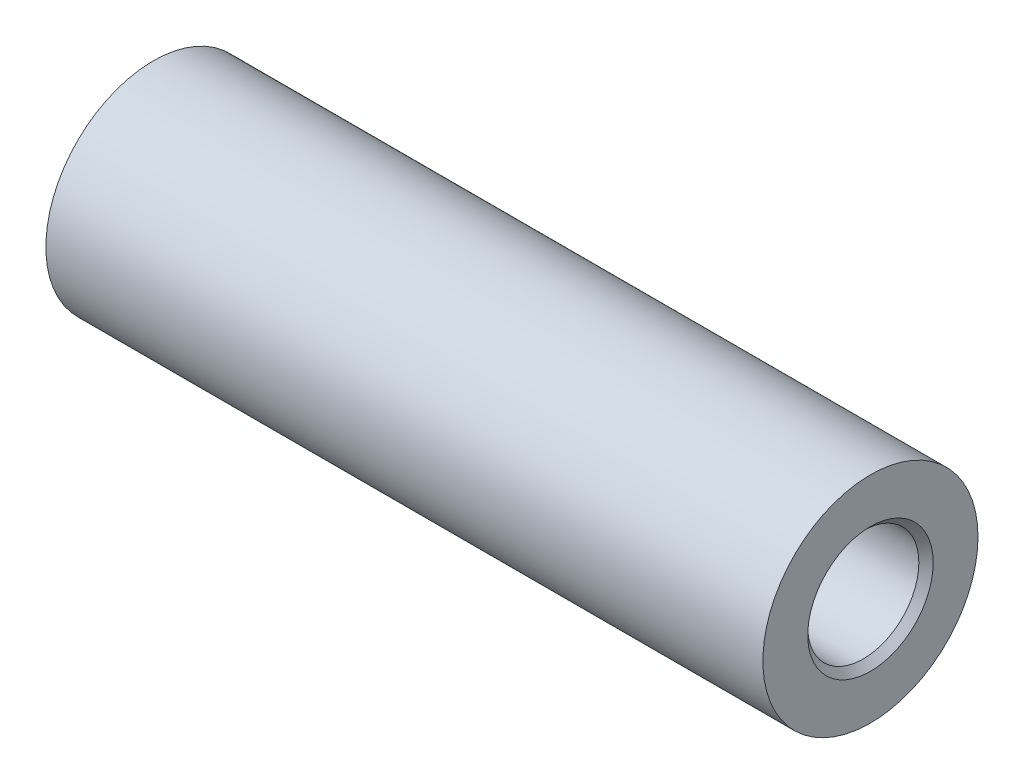
ISO-10303-21;
HEADER;
FILE_DESCRIPTION(('STEP AP214'),'2;1');
FILE_NAME('part.step','',(''),(''),'','','');
FILE_SCHEMA(('AUTOMOTIVE_DESIGN { 1 0 10303 214 1 1 1 1 }'));
ENDSEC;
DATA;
#1=APPLICATION_CONTEXT('core data for automotive mechanical design processes');
#2=APPLICATION_PROTOCOL_DEFINITION('international standard','automotive_design',2000,#1);
#3=PRODUCT_CONTEXT('',#1,'mechanical');
#4=PRODUCT('Part','Part','',(#3));
#5=PRODUCT_RELATED_PRODUCT_CATEGORY('part','',(#4));
#6=PRODUCT_DEFINITION_FORMATION('','',#4);
#7=PRODUCT_DEFINITION_CONTEXT('part definition',#1,'design');
#8=PRODUCT_DEFINITION('design','',#6,#7);
#9=PRODUCT_DEFINITION_SHAPE('','',#8);
#10=(LENGTH_UNIT() NAMED_UNIT(*) SI_UNIT(.MILLI.,.METRE.));
#11=(NAMED_UNIT(*) PLANE_ANGLE_UNIT() SI_UNIT($,.RADIAN.));
#12=(NAMED_UNIT(*) SI_UNIT($,.STERADIAN.) SOLID_ANGLE_UNIT());
#13=UNCERTAINTY_MEASURE_WITH_UNIT(LENGTH_MEASURE(1.E-05),#10,'distance_accuracy_value','');
#14=(GEOMETRIC_REPRESENTATION_CONTEXT(3) GLOBAL_UNCERTAINTY_ASSIGNED_CONTEXT((#13)) GLOBAL_UNIT_ASSIGNED_CONTEXT((#10,
#11,#12)) REPRESENTATION_CONTEXT('',''));
#15=CARTESIAN_POINT('',(0.,0.,0.));
#16=DIRECTION('',(0.,0.,1.));
#17=DIRECTION('',(1.,0.,0.));
#18=AXIS2_PLACEMENT_3D('',#15,#16,#17);
#19=CARTESIAN_POINT('',(0.,0.,0.));
#20=DIRECTION('',(-1.,0.,0.));
#21=DIRECTION('',(0.,0.,1.));
#22=AXIS2_PLACEMENT_3D('',#19,#20,#21);
#23=CYLINDRICAL_SURFACE('',#22,4.1);
#24=CARTESIAN_POINT('',(-20.6,0.,0.));
#25=DIRECTION('',(1.,0.,0.));
#26=DIRECTION('',(0.,0.,-1.));
#27=AXIS2_PLACEMENT_3D('',#24,#25,#26);
#28=CIRCLE('',#27,4.1);
#29=CARTESIAN_POINT('',(-20.6,0.,4.1));
#30=VERTEX_POINT('',#29);
#31=EDGE_CURVE('E138',#30,#30,#28,.F.);
#32=ORIENTED_EDGE('',*,*,#31,.T.);
#33=EDGE_LOOP('',(#32));
#34=FACE_BOUND('',#33,.T.);
#35=DIRECTION('',(1.,0.,0.));
#36=VECTOR('',#35,1.);
#37=CARTESIAN_POINT('',(-15.,3.70860840829682,-1.74820584426152));
#38=LINE('',#37,#36);
#39=CARTESIAN_POINT('',(-14.5,3.70860840829682,-1.74820584426152));
#40=VERTEX_POINT('',#39);
#41=CARTESIAN_POINT('',(0.,3.70860840829682,-1.74820584426152));
#42=VERTEX_POINT('',#41);
#43=EDGE_CURVE('E101',#40,#42,#38,.T.);
#44=ORIENTED_EDGE('',*,*,#43,.F.);
#45=CARTESIAN_POINT('',(-10.9,0.,0.));
#46=DIRECTION('',(-0.707106781186545,-0.705896069439704,-0.0413610825484487));
#47=DIRECTION('',(-0.70710678118655,0.7058960694397,0.0413610825484484));
#48=AXIS2_PLACEMENT_3D('',#45,#46,#47);
#49=ELLIPSE('',#48,5.79827560572971,4.1);
#50=CARTESIAN_POINT('',(-15.,4.09297995961269,0.239822955967241));
#51=VERTEX_POINT('',#50);
#52=EDGE_CURVE('E69',#40,#51,#49,.F.);
#53=ORIENTED_EDGE('',*,*,#52,.T.);
#54=CARTESIAN_POINT('',(-10.9,0.,0.));
#55=DIRECTION('',(-0.707106781186545,-0.705896069439704,-0.0413610825484487));
#56=DIRECTION('',(-0.70710678118655,0.7058960694397,0.0413610825484484));
#57=AXIS2_PLACEMENT_3D('',#54,#55,#56);
#58=ELLIPSE('',#57,5.79827560572971,4.1);
#59=CARTESIAN_POINT('',(-14.5,3.47906371590109,2.16935835230156));
#60=VERTEX_POINT('',#59);
#61=EDGE_CURVE('E96',#51,#60,#58,.F.);
#62=ORIENTED_EDGE('',*,*,#61,.T.);
#63=DIRECTION('',(1.,0.,0.));
#64=VECTOR('',#63,1.);
#65=CARTESIAN_POINT('',(-15.,3.47906371590109,2.16935835230156));
#66=LINE('',#65,#64);
#67=CARTESIAN_POINT('',(0.,3.47906371590109,2.16935835230156));
#68=VERTEX_POINT('',#67);
#69=EDGE_CURVE('E92',#60,#68,#66,.T.);
#70=ORIENTED_EDGE('',*,*,#69,.T.);
#71=CARTESIAN_POINT('',(0.,0.,0.));
#72=DIRECTION('',(-1.,0.,0.));
#73=DIRECTION('',(0.,0.,1.));
#74=AXIS2_PLACEMENT_3D('',#71,#72,#73);
#75=CIRCLE('',#74,4.1);
#76=EDGE_CURVE('E95',#42,#68,#75,.T.);
#77=ORIENTED_EDGE('',*,*,#76,.F.);
#78=EDGE_LOOP('',(#44,#53,#62,#70,#77));
#79=FACE_BOUND('',#78,.T.);
#80=ADVANCED_FACE('F46',(#34,#79),#23,.F.);
#81=CARTESIAN_POINT('',(0.,0.,0.));
#82=DIRECTION('',(-1.,0.,0.));
#83=DIRECTION('',(0.,0.,1.));
#84=AXIS2_PLACEMENT_3D('',#81,#82,#83);
#85=PLANE('',#84);
#86=ORIENTED_EDGE('',*,*,#76,.T.);
#87=DIRECTION('',(0.,-0.058493403894449,0.998287795027487));
#88=VECTOR('',#87,1.);
#89=CARTESIAN_POINT('',(0.,3.70860840829682,-1.74820584426152));
#90=LINE('',#89,#88);
#91=EDGE_CURVE('E102',#42,#68,#90,.T.);
#92=ORIENTED_EDGE('',*,*,#91,.F.);
#93=EDGE_LOOP('',(#86,#92));
#94=FACE_BOUND('',#93,.T.);
#95=ADVANCED_FACE('F109',(#94),#85,.T.);
#96=CARTESIAN_POINT('',(2.,0.,0.));
#97=DIRECTION('',(1.,0.,0.));
#98=DIRECTION('',(0.,0.,-1.));
#99=AXIS2_PLACEMENT_3D('',#96,#97,#98);
#100=CYLINDRICAL_SURFACE('',#99,3.1);
#101=CARTESIAN_POINT('',(18.6,0.,0.));
#102=DIRECTION('',(1.,0.,0.));
#103=DIRECTION('',(0.,0.,-1.));
#104=AXIS2_PLACEMENT_3D('',#101,#102,#103);
#105=CIRCLE('',#104,3.1);
#106=CARTESIAN_POINT('',(18.6,0.,-3.1));
#107=VERTEX_POINT('',#106);
#108=EDGE_CURVE('E130',#107,#107,#105,.T.);
#109=ORIENTED_EDGE('',*,*,#108,.T.);
#110=EDGE_LOOP('',(#109));
#111=FACE_BOUND('',#110,.T.);
#112=DIRECTION('',(-1.,0.,0.));
#113=VECTOR('',#112,1.);
#114=CARTESIAN_POINT('',(14.,2.6,1.68819430161341));
#115=LINE('',#114,#113);
#116=CARTESIAN_POINT('',(13.5,2.6,1.68819430161341));
#117=VERTEX_POINT('',#116);
#118=CARTESIAN_POINT('',(2.,2.6,1.68819430161341));
#119=VERTEX_POINT('',#118);
#120=EDGE_CURVE('E112',#117,#119,#115,.T.);
#121=ORIENTED_EDGE('',*,*,#120,.F.);
#122=CARTESIAN_POINT('',(10.9,0.,0.));
#123=DIRECTION('',(0.707106781186545,-0.70710678118655,0.));
#124=DIRECTION('',(0.70710678118655,0.707106781186545,0.));
#125=AXIS2_PLACEMENT_3D('',#122,#123,#124);
#126=ELLIPSE('',#125,4.38406204335661,3.1);
#127=CARTESIAN_POINT('',(14.,3.1,0.));
#128=VERTEX_POINT('',#127);
#129=EDGE_CURVE('E11',#117,#128,#126,.F.);
#130=ORIENTED_EDGE('',*,*,#129,.T.);
#131=CARTESIAN_POINT('',(10.9,0.,0.));
#132=DIRECTION('',(0.707106781186545,-0.70710678118655,0.));
#133=DIRECTION('',(0.70710678118655,0.707106781186545,0.));
#134=AXIS2_PLACEMENT_3D('',#131,#132,#133);
#135=ELLIPSE('',#134,4.38406204335661,3.1);
#136=CARTESIAN_POINT('',(13.5,2.6,-1.68819430161341));
#137=VERTEX_POINT('',#136);
#138=EDGE_CURVE('E56',#128,#137,#135,.F.);
#139=ORIENTED_EDGE('',*,*,#138,.T.);
#140=DIRECTION('',(-1.,0.,0.));
#141=VECTOR('',#140,1.);
#142=CARTESIAN_POINT('',(14.,2.6,-1.68819430161341));
#143=LINE('',#142,#141);
#144=CARTESIAN_POINT('',(2.,2.6,-1.68819430161341));
#145=VERTEX_POINT('',#144);
#146=EDGE_CURVE('E119',#137,#145,#143,.T.);
#147=ORIENTED_EDGE('',*,*,#146,.T.);
#148=CARTESIAN_POINT('',(2.,0.,0.));
#149=DIRECTION('',(1.,0.,0.));
#150=DIRECTION('',(0.,0.,-1.));
#151=AXIS2_PLACEMENT_3D('',#148,#149,#150);
#152=CIRCLE('',#151,3.1);
#153=EDGE_CURVE('E111',#119,#145,#152,.T.);
#154=ORIENTED_EDGE('',*,*,#153,.F.);
#155=EDGE_LOOP('',(#121,#130,#139,#147,#154));
#156=FACE_BOUND('',#155,.T.);
#157=ADVANCED_FACE('F158',(#111,#156),#100,.F.);
#158=CARTESIAN_POINT('',(2.,0.,0.));
#159=DIRECTION('',(1.,0.,0.));
#160=DIRECTION('',(0.,0.,-1.));
#161=AXIS2_PLACEMENT_3D('',#158,#159,#160);
#162=PLANE('',#161);
#163=ORIENTED_EDGE('',*,*,#153,.T.);
#164=DIRECTION('',(0.,0.,-1.));
#165=VECTOR('',#164,1.);
#166=CARTESIAN_POINT('',(2.,2.6,1.68819430161341));
#167=LINE('',#166,#165);
#168=EDGE_CURVE('E166',#119,#145,#167,.T.);
#169=ORIENTED_EDGE('',*,*,#168,.F.);
#170=EDGE_LOOP('',(#163,#169));
#171=FACE_BOUND('',#170,.T.);
#172=ADVANCED_FACE('F186',(#171),#162,.T.);
#173=CARTESIAN_POINT('',(-21.,0.,0.));
#174=DIRECTION('',(1.,0.,0.));
#175=DIRECTION('',(0.,0.,-1.));
#176=AXIS2_PLACEMENT_3D('',#173,#174,#175);
#177=CYLINDRICAL_SURFACE('',#176,6.);
#178=CARTESIAN_POINT('',(-21.,0.,0.));
#179=DIRECTION('',(1.,0.,0.));
#180=DIRECTION('',(0.,0.,-1.));
#181=AXIS2_PLACEMENT_3D('',#178,#179,#180);
#182=CIRCLE('',#181,6.);
#183=CARTESIAN_POINT('',(-21.,0.,-6.));
#184=VERTEX_POINT('',#183);
#185=EDGE_CURVE('E126',#184,#184,#182,.T.);
#186=CARTESIAN_POINT('',(19.,0.,0.));
#187=DIRECTION('',(1.,0.,0.));
#188=DIRECTION('',(0.,0.,-1.));
#189=AXIS2_PLACEMENT_3D('',#186,#187,#188);
#190=CIRCLE('',#189,6.);
#191=CARTESIAN_POINT('',(19.,0.,-6.));
#192=VERTEX_POINT('',#191);
#193=EDGE_CURVE('E117',#192,#192,#190,.T.);
#194=CARTESIAN_POINT('',(-21.,0.,-6.));
#195=CARTESIAN_POINT('',(-20.5833333333333,0.,-6.));
#196=CARTESIAN_POINT('',(-20.1666666666667,0.,-6.));
#197=CARTESIAN_POINT('',(-19.3333333333333,0.,-6.));
#198=CARTESIAN_POINT('',(-18.9166666666667,0.,-6.));
#199=CARTESIAN_POINT('',(-18.0833333333333,0.,-6.));
#200=CARTESIAN_POINT('',(-17.6666666666667,0.,-6.));
#201=CARTESIAN_POINT('',(-16.8333333333333,0.,-6.));
#202=CARTESIAN_POINT('',(-16.4166666666667,0.,-6.));
#203=CARTESIAN_POINT('',(-15.5833333333333,0.,-6.));
#204=CARTESIAN_POINT('',(-15.1666666666667,0.,-6.));
#205=CARTESIAN_POINT('',(-14.3333333333333,0.,-6.));
#206=CARTESIAN_POINT('',(-13.9166666666667,0.,-6.));
#207=CARTESIAN_POINT('',(-13.0833333333333,0.,-6.));
#208=CARTESIAN_POINT('',(-12.6666666666667,0.,-6.));
#209=CARTESIAN_POINT('',(-11.8333333333333,0.,-6.));
#210=CARTESIAN_POINT('',(-11.4166666666667,0.,-6.));
#211=CARTESIAN_POINT('',(-10.5833333333333,0.,-6.));
#212=CARTESIAN_POINT('',(-10.1666666666667,0.,-6.));
#213=CARTESIAN_POINT('',(-9.33333333333334,0.,-6.));
#214=CARTESIAN_POINT('',(-8.91666666666667,0.,-6.));
#215=CARTESIAN_POINT('',(-8.08333333333334,0.,-6.));
#216=CARTESIAN_POINT('',(-7.66666666666667,0.,-6.));
#217=CARTESIAN_POINT('',(-6.83333333333334,0.,-6.));
#218=CARTESIAN_POINT('',(-6.41666666666667,0.,-6.));
#219=CARTESIAN_POINT('',(-5.58333333333334,0.,-6.));
#220=CARTESIAN_POINT('',(-5.16666666666667,0.,-6.));
#221=CARTESIAN_POINT('',(-4.33333333333334,0.,-6.));
#222=CARTESIAN_POINT('',(-3.91666666666667,0.,-6.));
#223=CARTESIAN_POINT('',(-3.08333333333334,0.,-6.));
#224=CARTESIAN_POINT('',(-2.66666666666667,0.,-6.));
#225=CARTESIAN_POINT('',(-1.83333333333334,0.,-6.));
#226=CARTESIAN_POINT('',(-1.41666666666667,0.,-6.));
#227=CARTESIAN_POINT('',(-0.583333333333337,0.,-6.));
#228=CARTESIAN_POINT('',(-0.16666666666667,0.,-6.));
#229=CARTESIAN_POINT('',(0.666666666666664,0.,-6.));
#230=CARTESIAN_POINT('',(1.08333333333333,0.,-6.));
#231=CARTESIAN_POINT('',(1.91666666666666,0.,-6.));
#232=CARTESIAN_POINT('',(2.33333333333333,0.,-6.));
#233=CARTESIAN_POINT('',(3.16666666666666,0.,-6.));
#234=CARTESIAN_POINT('',(3.58333333333333,0.,-6.));
#235=CARTESIAN_POINT('',(4.41666666666666,0.,-6.));
#236=CARTESIAN_POINT('',(4.83333333333333,0.,-6.));
#237=CARTESIAN_POINT('',(5.66666666666666,0.,-6.));
#238=CARTESIAN_POINT('',(6.08333333333333,0.,-6.));
#239=CARTESIAN_POINT('',(6.91666666666666,0.,-6.));
#240=CARTESIAN_POINT('',(7.33333333333333,0.,-6.));
#241=CARTESIAN_POINT('',(8.16666666666666,0.,-6.));
#242=CARTESIAN_POINT('',(8.58333333333333,0.,-6.));
#243=CARTESIAN_POINT('',(9.41666666666667,0.,-6.));
#244=CARTESIAN_POINT('',(9.83333333333333,0.,-6.));
#245=CARTESIAN_POINT('',(10.6666666666667,0.,-6.));
#246=CARTESIAN_POINT('',(11.0833333333333,0.,-6.));
#247=CARTESIAN_POINT('',(11.9166666666667,0.,-6.));
#248=CARTESIAN_POINT('',(12.3333333333333,0.,-6.));
#249=CARTESIAN_POINT('',(13.1666666666667,0.,-6.));
#250=CARTESIAN_POINT('',(13.5833333333333,0.,-6.));
#251=CARTESIAN_POINT('',(14.4166666666667,0.,-6.));
#252=CARTESIAN_POINT('',(14.8333333333333,0.,-6.));
#253=CARTESIAN_POINT('',(15.6666666666667,0.,-6.));
#254=CARTESIAN_POINT('',(16.0833333333333,0.,-6.));
#255=CARTESIAN_POINT('',(16.9166666666667,0.,-6.));
#256=CARTESIAN_POINT('',(17.3333333333333,0.,-6.));
#257=CARTESIAN_POINT('',(18.1666666666667,0.,-6.));
#258=CARTESIAN_POINT('',(18.5833333333333,0.,-6.));
#259=CARTESIAN_POINT('',(19.,0.,-6.));
#260=B_SPLINE_CURVE_WITH_KNOTS('',3,(#194,#195,#196,#197,#198,#199,#200,#201,#202,#203,#204,
#205,#206,#207,#208,#209,#210,#211,#212,#213,#214,#215,#216,#217,#218,#219,#220,#221,#222,#223,
#224,#225,#226,#227,#228,#229,#230,#231,#232,#233,#234,#235,#236,#237,#238,#239,#240,#241,#242,
#243,#244,#245,#246,#247,#248,#249,#250,#251,#252,#253,#254,#255,#256,#257,#258,#259),
.UNSPECIFIED.,.F.,.F.,(4,2,2,2,2,2,2,2,2,2,2,2,2,2,2,2,2,2,2,2,2,2,2,2,2,2,2,2,2,2,2,2,4),(0.,
1.25,2.5,3.75,5.,6.25,7.5,8.75,10.,11.25,12.5,13.75,15.,16.25,17.5,18.75,20.,21.25,22.5,23.75,
25.,26.25,27.5,28.75,30.,31.25,32.5,33.75,35.,36.25,37.5,38.75,40.),.UNSPECIFIED.);
#261=EDGE_CURVE('BSEAM189',#184,#192,#260,.T.);
#262=ORIENTED_EDGE('',*,*,#185,.T.);
#263=ORIENTED_EDGE('',*,*,#193,.F.);
#264=ORIENTED_EDGE('',*,*,#261,.T.);
#265=ORIENTED_EDGE('',*,*,#261,.F.);
#266=EDGE_LOOP('',(#262,#264,#263,#265));
#267=FACE_BOUND('',#266,.T.);
#268=ADVANCED_FACE('F189',(#267),#177,.T.);
#269=CARTESIAN_POINT('',(-21.,0.,0.));
#270=DIRECTION('',(1.,0.,0.));
#271=DIRECTION('',(0.,0.,-1.));
#272=AXIS2_PLACEMENT_3D('',#269,#270,#271);
#273=PLANE('',#272);
#274=CARTESIAN_POINT('',(-21.,0.,0.));
#275=DIRECTION('',(1.,0.,0.));
#276=DIRECTION('',(0.,0.,-1.));
#277=AXIS2_PLACEMENT_3D('',#274,#275,#276);
#278=CIRCLE('',#277,4.50000000000002);
#279=CARTESIAN_POINT('',(-21.,0.,4.50000000000002));
#280=VERTEX_POINT('',#279);
#281=EDGE_CURVE('E142',#280,#280,#278,.T.);
#282=ORIENTED_EDGE('',*,*,#281,.T.);
#283=EDGE_LOOP('',(#282));
#284=FACE_BOUND('',#283,.T.);
#285=ORIENTED_EDGE('',*,*,#185,.F.);
#286=EDGE_LOOP('',(#285));
#287=FACE_BOUND('',#286,.T.);
#288=ADVANCED_FACE('F196',(#284,#287),#273,.F.);
#289=CARTESIAN_POINT('',(19.,0.,0.));
#290=DIRECTION('',(1.,0.,0.));
#291=DIRECTION('',(0.,0.,-1.));
#292=AXIS2_PLACEMENT_3D('',#289,#290,#291);
#293=PLANE('',#292);
#294=CARTESIAN_POINT('',(19.,0.,0.));
#295=DIRECTION('',(1.,0.,0.));
#296=DIRECTION('',(0.,0.,-1.));
#297=AXIS2_PLACEMENT_3D('',#294,#295,#296);
#298=CIRCLE('',#297,3.5);
#299=CARTESIAN_POINT('',(19.,0.,-3.5));
#300=VERTEX_POINT('',#299);
#301=EDGE_CURVE('E134',#300,#300,#298,.F.);
#302=ORIENTED_EDGE('',*,*,#301,.T.);
#303=EDGE_LOOP('',(#302));
#304=FACE_BOUND('',#303,.T.);
#305=ORIENTED_EDGE('',*,*,#193,.T.);
#306=EDGE_LOOP('',(#305));
#307=FACE_BOUND('',#306,.T.);
#308=ADVANCED_FACE('F193',(#304,#307),#293,.T.);
#309=CARTESIAN_POINT('',(14.,2.6,1.68819430161341));
#310=DIRECTION('',(0.,1.,0.));
#311=DIRECTION('',(0.,0.,1.));
#312=AXIS2_PLACEMENT_3D('',#309,#310,#311);
#313=PLANE('',#312);
#314=ORIENTED_EDGE('',*,*,#146,.F.);
#315=DIRECTION('',(0.,0.,1.));
#316=VECTOR('',#315,1.);
#317=CARTESIAN_POINT('',(13.5,2.6,1.68819430161341));
#318=LINE('',#317,#316);
#319=EDGE_CURVE('E149',#137,#117,#318,.T.);
#320=ORIENTED_EDGE('',*,*,#319,.T.);
#321=ORIENTED_EDGE('',*,*,#120,.T.);
#322=ORIENTED_EDGE('',*,*,#168,.T.);
#323=EDGE_LOOP('',(#314,#320,#321,#322));
#324=FACE_BOUND('',#323,.T.);
#325=ADVANCED_FACE('F164',(#324),#313,.F.);
#326=CARTESIAN_POINT('',(-15.,3.70860840829682,-1.74820584426152));
#327=DIRECTION('',(0.,0.998287795027487,0.058493403894449));
#328=DIRECTION('',(0.,-0.058493403894449,0.998287795027487));
#329=AXIS2_PLACEMENT_3D('',#326,#327,#328);
#330=PLANE('',#329);
#331=ORIENTED_EDGE('',*,*,#69,.F.);
#332=DIRECTION('',(0.,0.058493403894449,-0.998287795027487));
#333=VECTOR('',#332,1.);
#334=CARTESIAN_POINT('',(-14.5,3.70860840829682,-1.74820584426152));
#335=LINE('',#334,#333);
#336=EDGE_CURVE('E146',#60,#40,#335,.T.);
#337=ORIENTED_EDGE('',*,*,#336,.T.);
#338=ORIENTED_EDGE('',*,*,#43,.T.);
#339=ORIENTED_EDGE('',*,*,#91,.T.);
#340=EDGE_LOOP('',(#331,#337,#338,#339));
#341=FACE_BOUND('',#340,.T.);
#342=ADVANCED_FACE('F105',(#341),#330,.F.);
#343=CARTESIAN_POINT('',(18.6,0.,0.));
#344=DIRECTION('',(1.,0.,0.));
#345=DIRECTION('',(0.,0.,-1.));
#346=AXIS2_PLACEMENT_3D('',#343,#344,#345);
#347=CONICAL_SURFACE('',#346,3.1,0.785398163397447);
#348=ORIENTED_EDGE('',*,*,#301,.F.);
#349=EDGE_LOOP('',(#348));
#350=FACE_BOUND('',#349,.T.);
#351=ORIENTED_EDGE('',*,*,#108,.F.);
#352=EDGE_LOOP('',(#351));
#353=FACE_BOUND('',#352,.T.);
#354=ADVANCED_FACE('F205',(#350,#353),#347,.F.);
#355=CARTESIAN_POINT('',(-20.6,0.,0.));
#356=DIRECTION('',(-1.,0.,0.));
#357=DIRECTION('',(0.,0.,1.));
#358=AXIS2_PLACEMENT_3D('',#355,#356,#357);
#359=CONICAL_SURFACE('',#358,4.1,0.785398163397447);
#360=CARTESIAN_POINT('',(-21.,0.,4.50000000000002));
#361=CARTESIAN_POINT('',(-20.9958333333333,0.,4.49583333333335));
#362=CARTESIAN_POINT('',(-20.9916666666667,0.,4.49166666666669));
#363=CARTESIAN_POINT('',(-20.9833333333333,0.,4.48333333333335));
#364=CARTESIAN_POINT('',(-20.9791666666667,0.,4.47916666666669));
#365=CARTESIAN_POINT('',(-20.9708333333333,0.,4.47083333333335));
#366=CARTESIAN_POINT('',(-20.9666666666667,0.,4.46666666666669));
#367=CARTESIAN_POINT('',(-20.9583333333333,0.,4.45833333333335));
#368=CARTESIAN_POINT('',(-20.9541666666667,0.,4.45416666666669));
#369=CARTESIAN_POINT('',(-20.9458333333333,0.,4.44583333333335));
#370=CARTESIAN_POINT('',(-20.9416666666667,0.,4.44166666666669));
#371=CARTESIAN_POINT('',(-20.9333333333333,0.,4.43333333333335));
#372=CARTESIAN_POINT('',(-20.9291666666667,0.,4.42916666666668));
#373=CARTESIAN_POINT('',(-20.9208333333333,0.,4.42083333333335));
#374=CARTESIAN_POINT('',(-20.9166666666667,0.,4.41666666666668));
#375=CARTESIAN_POINT('',(-20.9083333333333,0.,4.40833333333335));
#376=CARTESIAN_POINT('',(-20.9041666666667,0.,4.40416666666668));
#377=CARTESIAN_POINT('',(-20.8958333333333,0.,4.39583333333335));
#378=CARTESIAN_POINT('',(-20.8916666666667,0.,4.39166666666668));
#379=CARTESIAN_POINT('',(-20.8833333333333,0.,4.38333333333335));
#380=CARTESIAN_POINT('',(-20.8791666666667,0.,4.37916666666668));
#381=CARTESIAN_POINT('',(-20.8708333333333,0.,4.37083333333335));
#382=CARTESIAN_POINT('',(-20.8666666666667,0.,4.36666666666668));
#383=CARTESIAN_POINT('',(-20.8583333333333,0.,4.35833333333335));
#384=CARTESIAN_POINT('',(-20.8541666666667,0.,4.35416666666668));
#385=CARTESIAN_POINT('',(-20.8458333333333,0.,4.34583333333335));
#386=CARTESIAN_POINT('',(-20.8416666666667,0.,4.34166666666668));
#387=CARTESIAN_POINT('',(-20.8333333333333,0.,4.33333333333335));
#388=CARTESIAN_POINT('',(-20.8291666666667,0.,4.32916666666668));
#389=CARTESIAN_POINT('',(-20.8208333333333,0.,4.32083333333334));
#390=CARTESIAN_POINT('',(-20.8166666666667,0.,4.31666666666668));
#391=CARTESIAN_POINT('',(-20.8083333333333,0.,4.30833333333334));
#392=CARTESIAN_POINT('',(-20.8041666666667,0.,4.30416666666668));
#393=CARTESIAN_POINT('',(-20.7958333333333,0.,4.29583333333334));
#394=CARTESIAN_POINT('',(-20.7916666666667,0.,4.29166666666668));
#395=CARTESIAN_POINT('',(-20.7833333333333,0.,4.28333333333334));
#396=CARTESIAN_POINT('',(-20.7791666666667,0.,4.27916666666668));
#397=CARTESIAN_POINT('',(-20.7708333333333,0.,4.27083333333334));
#398=CARTESIAN_POINT('',(-20.7666666666667,0.,4.26666666666667));
#399=CARTESIAN_POINT('',(-20.7583333333333,0.,4.25833333333334));
#400=CARTESIAN_POINT('',(-20.7541666666667,0.,4.25416666666667));
#401=CARTESIAN_POINT('',(-20.7458333333333,0.,4.24583333333334));
#402=CARTESIAN_POINT('',(-20.7416666666667,0.,4.24166666666667));
#403=CARTESIAN_POINT('',(-20.7333333333333,0.,4.23333333333334));
#404=CARTESIAN_POINT('',(-20.7291666666667,0.,4.22916666666667));
#405=CARTESIAN_POINT('',(-20.7208333333333,0.,4.22083333333334));
#406=CARTESIAN_POINT('',(-20.7166666666667,0.,4.21666666666667));
#407=CARTESIAN_POINT('',(-20.7083333333333,0.,4.20833333333334));
#408=CARTESIAN_POINT('',(-20.7041666666666,0.,4.20416666666667));
#409=CARTESIAN_POINT('',(-20.6958333333333,0.,4.19583333333334));
#410=CARTESIAN_POINT('',(-20.6916666666666,0.,4.19166666666667));
#411=CARTESIAN_POINT('',(-20.6833333333333,0.,4.18333333333334));
#412=CARTESIAN_POINT('',(-20.6791666666666,0.,4.17916666666667));
#413=CARTESIAN_POINT('',(-20.6708333333333,0.,4.17083333333334));
#414=CARTESIAN_POINT('',(-20.6666666666667,0.,4.16666666666667));
#415=CARTESIAN_POINT('',(-20.6583333333333,0.,4.15833333333333));
#416=CARTESIAN_POINT('',(-20.6541666666666,0.,4.15416666666667));
#417=CARTESIAN_POINT('',(-20.6458333333333,0.,4.14583333333333));
#418=CARTESIAN_POINT('',(-20.6416666666666,0.,4.14166666666667));
#419=CARTESIAN_POINT('',(-20.6333333333333,0.,4.13333333333333));
#420=CARTESIAN_POINT('',(-20.6291666666666,0.,4.12916666666667));
#421=CARTESIAN_POINT('',(-20.6208333333333,0.,4.12083333333333));
#422=CARTESIAN_POINT('',(-20.6166666666666,0.,4.11666666666667));
#423=CARTESIAN_POINT('',(-20.6083333333333,0.,4.10833333333333));
#424=CARTESIAN_POINT('',(-20.6041666666666,0.,4.10416666666667));
#425=CARTESIAN_POINT('',(-20.6,0.,4.1));
#426=B_SPLINE_CURVE_WITH_KNOTS('',3,(#360,#361,#362,#363,#364,#365,#366,#367,#368,#369,#370,
#371,#372,#373,#374,#375,#376,#377,#378,#379,#380,#381,#382,#383,#384,#385,#386,#387,#388,#389,
#390,#391,#392,#393,#394,#395,#396,#397,#398,#399,#400,#401,#402,#403,#404,#405,#406,#407,#408,
#409,#410,#411,#412,#413,#414,#415,#416,#417,#418,#419,#420,#421,#422,#423,#424,#425),
.UNSPECIFIED.,.F.,.F.,(4,2,2,2,2,2,2,2,2,2,2,2,2,2,2,2,2,2,2,2,2,2,2,2,2,2,2,2,2,2,2,2,4),(0.,
0.0176776695296636,0.035355339059329,0.053033008588992,0.070710678118658,0.0883883476483234,
0.106066017177987,0.123743686707652,0.141421356237318,0.159099025766981,0.176776695296647,
0.19445436482631,0.212132034355976,0.229809703885642,0.247487373415305,0.265165042944971,
0.282842712474636,0.3005203820043,0.318198051533965,0.335875721063629,0.353553390593294,
0.37123106012296,0.388908729652623,0.406586399182289,0.424264068711955,0.441941738241618,
0.459619407771284,0.477297077300948,0.494974746830613,0.512652416360279,0.530330085889942,
0.548007755419608,0.565685424949271),.UNSPECIFIED.);
#427=EDGE_CURVE('BSEAM173',#280,#30,#426,.T.);
#428=ORIENTED_EDGE('',*,*,#281,.F.);
#429=ORIENTED_EDGE('',*,*,#31,.F.);
#430=ORIENTED_EDGE('',*,*,#427,.T.);
#431=ORIENTED_EDGE('',*,*,#427,.F.);
#432=EDGE_LOOP('',(#428,#430,#429,#431));
#433=FACE_BOUND('',#432,.T.);
#434=ADVANCED_FACE('F173',(#433),#359,.F.);
#435=CARTESIAN_POINT('',(-15.,4.09297995961269,0.239822955967241));
#436=DIRECTION('',(-0.707106781186545,-0.705896069439704,-0.0413610825484487));
#437=DIRECTION('',(0.,0.058493403894449,-0.998287795027487));
#438=AXIS2_PLACEMENT_3D('',#435,#436,#437);
#439=PLANE('',#438);
#440=ORIENTED_EDGE('',*,*,#52,.F.);
#441=ORIENTED_EDGE('',*,*,#336,.F.);
#442=ORIENTED_EDGE('',*,*,#61,.F.);
#443=EDGE_LOOP('',(#440,#441,#442));
#444=FACE_BOUND('',#443,.T.);
#445=ADVANCED_FACE('F169',(#444),#439,.T.);
#446=CARTESIAN_POINT('',(14.,3.1,0.));
#447=DIRECTION('',(0.707106781186545,-0.70710678118655,0.));
#448=DIRECTION('',(0.,0.,1.));
#449=AXIS2_PLACEMENT_3D('',#446,#447,#448);
#450=PLANE('',#449);
#451=ORIENTED_EDGE('',*,*,#129,.F.);
#452=ORIENTED_EDGE('',*,*,#319,.F.);
#453=ORIENTED_EDGE('',*,*,#138,.F.);
#454=EDGE_LOOP('',(#451,#452,#453));
#455=FACE_BOUND('',#454,.T.);
#456=ADVANCED_FACE('F49',(#455),#450,.T.);
#457=CLOSED_SHELL('',(#80,#95,#157,#172,#268,#288,#308,#325,#342,#354,#434,#445,#456));
#458=MANIFOLD_SOLID_BREP('B2',#457);
#459=ADVANCED_BREP_SHAPE_REPRESENTATION('',(#18,#458),#14);
#460=SHAPE_DEFINITION_REPRESENTATION(#9,#459);
ENDSEC;
END-ISO-10303-21;
